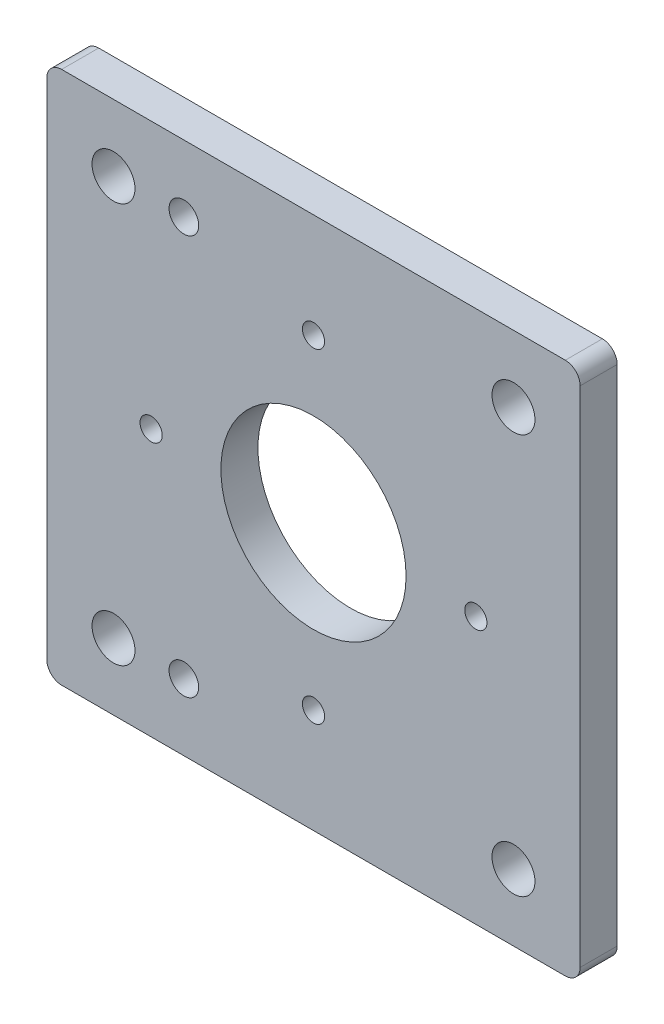
ISO-10303-21;
HEADER;
FILE_DESCRIPTION(('STEP AP214'),'2;1');
FILE_NAME('part.step','',(''),(''),'','','');
FILE_SCHEMA(('AUTOMOTIVE_DESIGN { 1 0 10303 214 1 1 1 1 }'));
ENDSEC;
DATA;
#1=APPLICATION_CONTEXT('core data for automotive mechanical design processes');
#2=APPLICATION_PROTOCOL_DEFINITION('international standard','automotive_design',2000,#1);
#3=PRODUCT_CONTEXT('',#1,'mechanical');
#4=PRODUCT('Part','Part','',(#3));
#5=PRODUCT_RELATED_PRODUCT_CATEGORY('part','',(#4));
#6=PRODUCT_DEFINITION_FORMATION('','',#4);
#7=PRODUCT_DEFINITION_CONTEXT('part definition',#1,'design');
#8=PRODUCT_DEFINITION('design','',#6,#7);
#9=PRODUCT_DEFINITION_SHAPE('','',#8);
#10=(LENGTH_UNIT() NAMED_UNIT(*) SI_UNIT(.MILLI.,.METRE.));
#11=(NAMED_UNIT(*) PLANE_ANGLE_UNIT() SI_UNIT($,.RADIAN.));
#12=(NAMED_UNIT(*) SI_UNIT($,.STERADIAN.) SOLID_ANGLE_UNIT());
#13=UNCERTAINTY_MEASURE_WITH_UNIT(LENGTH_MEASURE(1.E-05),#10,'distance_accuracy_value','');
#14=(GEOMETRIC_REPRESENTATION_CONTEXT(3) GLOBAL_UNCERTAINTY_ASSIGNED_CONTEXT((#13)) GLOBAL_UNIT_ASSIGNED_CONTEXT((#10,
#11,#12)) REPRESENTATION_CONTEXT('',''));
#15=CARTESIAN_POINT('',(0.,0.,0.));
#16=DIRECTION('',(0.,0.,1.));
#17=DIRECTION('',(1.,0.,0.));
#18=AXIS2_PLACEMENT_3D('',#15,#16,#17);
#19=CARTESIAN_POINT('',(0.,0.,5.));
#20=DIRECTION('',(0.,0.,1.));
#21=DIRECTION('',(1.,0.,0.));
#22=AXIS2_PLACEMENT_3D('',#19,#20,#21);
#23=PLANE('',#22);
#24=CARTESIAN_POINT('',(-17.5,-27.,5.));
#25=DIRECTION('',(0.,0.,1.));
#26=DIRECTION('',(1.,0.,0.));
#27=AXIS2_PLACEMENT_3D('',#24,#25,#26);
#28=CIRCLE('',#27,2.);
#29=CARTESIAN_POINT('',(-15.5,-27.,5.));
#30=VERTEX_POINT('',#29);
#31=EDGE_CURVE('E211',#30,#30,#28,.T.);
#32=ORIENTED_EDGE('',*,*,#31,.F.);
#33=EDGE_LOOP('',(#32));
#34=FACE_BOUND('',#33,.T.);
#35=CARTESIAN_POINT('',(-21.92,0.,5.));
#36=DIRECTION('',(0.,0.,1.));
#37=DIRECTION('',(1.,0.,0.));
#38=AXIS2_PLACEMENT_3D('',#35,#36,#37);
#39=CIRCLE('',#38,1.5);
#40=CARTESIAN_POINT('',(-20.42,0.,5.));
#41=VERTEX_POINT('',#40);
#42=EDGE_CURVE('E223',#41,#41,#39,.T.);
#43=ORIENTED_EDGE('',*,*,#42,.F.);
#44=EDGE_LOOP('',(#43));
#45=FACE_BOUND('',#44,.T.);
#46=CARTESIAN_POINT('',(0.,0.,5.));
#47=DIRECTION('',(0.,0.,1.));
#48=DIRECTION('',(1.,0.,0.));
#49=AXIS2_PLACEMENT_3D('',#46,#47,#48);
#50=CIRCLE('',#49,12.5);
#51=CARTESIAN_POINT('',(12.5,0.,5.));
#52=VERTEX_POINT('',#51);
#53=EDGE_CURVE('E233',#52,#52,#50,.T.);
#54=ORIENTED_EDGE('',*,*,#53,.F.);
#55=EDGE_LOOP('',(#54));
#56=FACE_BOUND('',#55,.T.);
#57=CARTESIAN_POINT('',(-27.,-27.,5.));
#58=DIRECTION('',(0.,0.,1.));
#59=DIRECTION('',(1.,0.,0.));
#60=AXIS2_PLACEMENT_3D('',#57,#58,#59);
#61=CIRCLE('',#60,2.9);
#62=CARTESIAN_POINT('',(-24.1,-27.,5.));
#63=VERTEX_POINT('',#62);
#64=EDGE_CURVE('E243',#63,#63,#61,.T.);
#65=ORIENTED_EDGE('',*,*,#64,.F.);
#66=EDGE_LOOP('',(#65));
#67=FACE_BOUND('',#66,.T.);
#68=CARTESIAN_POINT('',(27.,27.,5.));
#69=DIRECTION('',(0.,0.,1.));
#70=DIRECTION('',(1.,0.,0.));
#71=AXIS2_PLACEMENT_3D('',#68,#69,#70);
#72=CIRCLE('',#71,2.9);
#73=CARTESIAN_POINT('',(29.9,27.,5.));
#74=VERTEX_POINT('',#73);
#75=EDGE_CURVE('E253',#74,#74,#72,.T.);
#76=ORIENTED_EDGE('',*,*,#75,.F.);
#77=EDGE_LOOP('',(#76));
#78=FACE_BOUND('',#77,.T.);
#79=DIRECTION('',(0.,-1.,0.));
#80=VECTOR('',#79,1.);
#81=CARTESIAN_POINT('',(-36.,-36.,5.));
#82=LINE('',#81,#80);
#83=CARTESIAN_POINT('',(-36.,34.,5.));
#84=VERTEX_POINT('',#83);
#85=CARTESIAN_POINT('',(-36.,-34.,5.));
#86=VERTEX_POINT('',#85);
#87=EDGE_CURVE('E139',#84,#86,#82,.T.);
#88=ORIENTED_EDGE('',*,*,#87,.T.);
#89=CARTESIAN_POINT('',(-34.,-34.,5.));
#90=DIRECTION('',(0.,0.,1.));
#91=DIRECTION('',(1.,0.,0.));
#92=AXIS2_PLACEMENT_3D('',#89,#90,#91);
#93=CIRCLE('',#92,2.);
#94=CARTESIAN_POINT('',(-34.,-36.,5.));
#95=VERTEX_POINT('',#94);
#96=EDGE_CURVE('E154',#86,#95,#93,.T.);
#97=ORIENTED_EDGE('',*,*,#96,.T.);
#98=DIRECTION('',(1.,0.,0.));
#99=VECTOR('',#98,1.);
#100=CARTESIAN_POINT('',(36.,-36.,5.));
#101=LINE('',#100,#99);
#102=CARTESIAN_POINT('',(34.,-36.,5.));
#103=VERTEX_POINT('',#102);
#104=EDGE_CURVE('E121',#95,#103,#101,.T.);
#105=ORIENTED_EDGE('',*,*,#104,.T.);
#106=CARTESIAN_POINT('',(34.,-34.,5.));
#107=DIRECTION('',(0.,0.,1.));
#108=DIRECTION('',(1.,0.,0.));
#109=AXIS2_PLACEMENT_3D('',#106,#107,#108);
#110=CIRCLE('',#109,2.);
#111=CARTESIAN_POINT('',(36.,-34.,5.));
#112=VERTEX_POINT('',#111);
#113=EDGE_CURVE('E152',#103,#112,#110,.T.);
#114=ORIENTED_EDGE('',*,*,#113,.T.);
#115=DIRECTION('',(0.,1.,0.));
#116=VECTOR('',#115,1.);
#117=CARTESIAN_POINT('',(36.,-36.,5.));
#118=LINE('',#117,#116);
#119=CARTESIAN_POINT('',(36.,34.,5.));
#120=VERTEX_POINT('',#119);
#121=EDGE_CURVE('E174',#112,#120,#118,.T.);
#122=ORIENTED_EDGE('',*,*,#121,.T.);
#123=CARTESIAN_POINT('',(34.,34.,5.));
#124=DIRECTION('',(0.,0.,1.));
#125=DIRECTION('',(1.,0.,0.));
#126=AXIS2_PLACEMENT_3D('',#123,#124,#125);
#127=CIRCLE('',#126,2.);
#128=CARTESIAN_POINT('',(34.,36.,5.));
#129=VERTEX_POINT('',#128);
#130=EDGE_CURVE('E56',#120,#129,#127,.T.);
#131=ORIENTED_EDGE('',*,*,#130,.T.);
#132=DIRECTION('',(-1.,0.,0.));
#133=VECTOR('',#132,1.);
#134=CARTESIAN_POINT('',(36.,36.,5.));
#135=LINE('',#134,#133);
#136=CARTESIAN_POINT('',(-34.,36.,5.));
#137=VERTEX_POINT('',#136);
#138=EDGE_CURVE('E140',#129,#137,#135,.T.);
#139=ORIENTED_EDGE('',*,*,#138,.T.);
#140=CARTESIAN_POINT('',(-34.,34.,5.));
#141=DIRECTION('',(0.,0.,1.));
#142=DIRECTION('',(1.,0.,0.));
#143=AXIS2_PLACEMENT_3D('',#140,#141,#142);
#144=CIRCLE('',#143,2.);
#145=EDGE_CURVE('E150',#137,#84,#144,.T.);
#146=ORIENTED_EDGE('',*,*,#145,.T.);
#147=EDGE_LOOP('',(#88,#97,#105,#114,#122,#131,#139,#146));
#148=FACE_BOUND('',#147,.T.);
#149=CARTESIAN_POINT('',(-27.,27.,5.));
#150=DIRECTION('',(0.,0.,1.));
#151=DIRECTION('',(1.,0.,0.));
#152=AXIS2_PLACEMENT_3D('',#149,#150,#151);
#153=CIRCLE('',#152,2.9);
#154=CARTESIAN_POINT('',(-24.1,27.,5.));
#155=VERTEX_POINT('',#154);
#156=EDGE_CURVE('E134',#155,#155,#153,.T.);
#157=ORIENTED_EDGE('',*,*,#156,.F.);
#158=EDGE_LOOP('',(#157));
#159=FACE_BOUND('',#158,.T.);
#160=CARTESIAN_POINT('',(27.,-27.,5.));
#161=DIRECTION('',(0.,0.,1.));
#162=DIRECTION('',(1.,0.,0.));
#163=AXIS2_PLACEMENT_3D('',#160,#161,#162);
#164=CIRCLE('',#163,2.9);
#165=CARTESIAN_POINT('',(29.9,-27.,5.));
#166=VERTEX_POINT('',#165);
#167=EDGE_CURVE('E190',#166,#166,#164,.T.);
#168=ORIENTED_EDGE('',*,*,#167,.F.);
#169=EDGE_LOOP('',(#168));
#170=FACE_BOUND('',#169,.T.);
#171=CARTESIAN_POINT('',(0.,21.92,5.));
#172=DIRECTION('',(0.,0.,1.));
#173=DIRECTION('',(1.,0.,0.));
#174=AXIS2_PLACEMENT_3D('',#171,#172,#173);
#175=CIRCLE('',#174,1.5);
#176=CARTESIAN_POINT('',(1.5,21.92,5.));
#177=VERTEX_POINT('',#176);
#178=EDGE_CURVE('E194',#177,#177,#175,.T.);
#179=ORIENTED_EDGE('',*,*,#178,.F.);
#180=EDGE_LOOP('',(#179));
#181=FACE_BOUND('',#180,.T.);
#182=CARTESIAN_POINT('',(0.,-21.92,5.));
#183=DIRECTION('',(0.,0.,1.));
#184=DIRECTION('',(1.,0.,0.));
#185=AXIS2_PLACEMENT_3D('',#182,#183,#184);
#186=CIRCLE('',#185,1.5);
#187=CARTESIAN_POINT('',(1.5,-21.92,5.));
#188=VERTEX_POINT('',#187);
#189=EDGE_CURVE('E198',#188,#188,#186,.T.);
#190=ORIENTED_EDGE('',*,*,#189,.F.);
#191=EDGE_LOOP('',(#190));
#192=FACE_BOUND('',#191,.T.);
#193=CARTESIAN_POINT('',(21.92,0.,5.));
#194=DIRECTION('',(0.,0.,1.));
#195=DIRECTION('',(1.,0.,0.));
#196=AXIS2_PLACEMENT_3D('',#193,#194,#195);
#197=CIRCLE('',#196,1.5);
#198=CARTESIAN_POINT('',(23.42,0.,5.));
#199=VERTEX_POINT('',#198);
#200=EDGE_CURVE('E202',#199,#199,#197,.T.);
#201=ORIENTED_EDGE('',*,*,#200,.F.);
#202=EDGE_LOOP('',(#201));
#203=FACE_BOUND('',#202,.T.);
#204=CARTESIAN_POINT('',(-17.5,27.,5.));
#205=DIRECTION('',(0.,0.,1.));
#206=DIRECTION('',(1.,0.,0.));
#207=AXIS2_PLACEMENT_3D('',#204,#205,#206);
#208=CIRCLE('',#207,2.);
#209=CARTESIAN_POINT('',(-15.5,27.,5.));
#210=VERTEX_POINT('',#209);
#211=EDGE_CURVE('E205',#210,#210,#208,.T.);
#212=ORIENTED_EDGE('',*,*,#211,.F.);
#213=EDGE_LOOP('',(#212));
#214=FACE_BOUND('',#213,.T.);
#215=ADVANCED_FACE('F36',(#34,#45,#56,#67,#78,#148,#159,#170,#181,#192,#203,#214),#23,.T.);
#216=CARTESIAN_POINT('',(0.,0.,0.));
#217=DIRECTION('',(0.,0.,1.));
#218=DIRECTION('',(1.,0.,0.));
#219=AXIS2_PLACEMENT_3D('',#216,#217,#218);
#220=PLANE('',#219);
#221=DIRECTION('',(1.,0.,0.));
#222=VECTOR('',#221,1.);
#223=CARTESIAN_POINT('',(36.,-36.,0.));
#224=LINE('',#223,#222);
#225=CARTESIAN_POINT('',(-34.,-36.,0.));
#226=VERTEX_POINT('',#225);
#227=CARTESIAN_POINT('',(34.,-36.,0.));
#228=VERTEX_POINT('',#227);
#229=EDGE_CURVE('E118',#226,#228,#224,.T.);
#230=ORIENTED_EDGE('',*,*,#229,.F.);
#231=CARTESIAN_POINT('',(-34.,-34.,0.));
#232=DIRECTION('',(0.,0.,1.));
#233=DIRECTION('',(1.,0.,0.));
#234=AXIS2_PLACEMENT_3D('',#231,#232,#233);
#235=CIRCLE('',#234,2.);
#236=CARTESIAN_POINT('',(-36.,-34.,0.));
#237=VERTEX_POINT('',#236);
#238=EDGE_CURVE('E101',#226,#237,#235,.F.);
#239=ORIENTED_EDGE('',*,*,#238,.T.);
#240=DIRECTION('',(0.,-1.,0.));
#241=VECTOR('',#240,1.);
#242=CARTESIAN_POINT('',(-36.,-36.,0.));
#243=LINE('',#242,#241);
#244=CARTESIAN_POINT('',(-36.,34.,0.));
#245=VERTEX_POINT('',#244);
#246=EDGE_CURVE('E129',#245,#237,#243,.T.);
#247=ORIENTED_EDGE('',*,*,#246,.F.);
#248=CARTESIAN_POINT('',(-34.,34.,0.));
#249=DIRECTION('',(0.,0.,1.));
#250=DIRECTION('',(1.,0.,0.));
#251=AXIS2_PLACEMENT_3D('',#248,#249,#250);
#252=CIRCLE('',#251,2.);
#253=CARTESIAN_POINT('',(-34.,36.,0.));
#254=VERTEX_POINT('',#253);
#255=EDGE_CURVE('E143',#245,#254,#252,.F.);
#256=ORIENTED_EDGE('',*,*,#255,.T.);
#257=DIRECTION('',(-1.,0.,0.));
#258=VECTOR('',#257,1.);
#259=CARTESIAN_POINT('',(36.,36.,0.));
#260=LINE('',#259,#258);
#261=CARTESIAN_POINT('',(34.,36.,0.));
#262=VERTEX_POINT('',#261);
#263=EDGE_CURVE('E132',#262,#254,#260,.T.);
#264=ORIENTED_EDGE('',*,*,#263,.F.);
#265=CARTESIAN_POINT('',(34.,34.,0.));
#266=DIRECTION('',(0.,0.,1.));
#267=DIRECTION('',(1.,0.,0.));
#268=AXIS2_PLACEMENT_3D('',#265,#266,#267);
#269=CIRCLE('',#268,2.);
#270=CARTESIAN_POINT('',(36.,34.,0.));
#271=VERTEX_POINT('',#270);
#272=EDGE_CURVE('E122',#262,#271,#269,.F.);
#273=ORIENTED_EDGE('',*,*,#272,.T.);
#274=DIRECTION('',(0.,1.,0.));
#275=VECTOR('',#274,1.);
#276=CARTESIAN_POINT('',(36.,-36.,0.));
#277=LINE('',#276,#275);
#278=CARTESIAN_POINT('',(36.,-34.,0.));
#279=VERTEX_POINT('',#278);
#280=EDGE_CURVE('E128',#279,#271,#277,.T.);
#281=ORIENTED_EDGE('',*,*,#280,.F.);
#282=CARTESIAN_POINT('',(34.,-34.,0.));
#283=DIRECTION('',(0.,0.,1.));
#284=DIRECTION('',(1.,0.,0.));
#285=AXIS2_PLACEMENT_3D('',#282,#283,#284);
#286=CIRCLE('',#285,2.);
#287=EDGE_CURVE('E112',#279,#228,#286,.F.);
#288=ORIENTED_EDGE('',*,*,#287,.T.);
#289=EDGE_LOOP('',(#230,#239,#247,#256,#264,#273,#281,#288));
#290=FACE_BOUND('',#289,.T.);
#291=CARTESIAN_POINT('',(-27.,27.,0.));
#292=DIRECTION('',(0.,0.,1.));
#293=DIRECTION('',(1.,0.,0.));
#294=AXIS2_PLACEMENT_3D('',#291,#292,#293);
#295=CIRCLE('',#294,2.9);
#296=CARTESIAN_POINT('',(-24.1,27.,0.));
#297=VERTEX_POINT('',#296);
#298=EDGE_CURVE('E177',#297,#297,#295,.T.);
#299=ORIENTED_EDGE('',*,*,#298,.T.);
#300=EDGE_LOOP('',(#299));
#301=FACE_BOUND('',#300,.T.);
#302=CARTESIAN_POINT('',(27.,27.,0.));
#303=DIRECTION('',(0.,0.,1.));
#304=DIRECTION('',(1.,0.,0.));
#305=AXIS2_PLACEMENT_3D('',#302,#303,#304);
#306=CIRCLE('',#305,2.9);
#307=CARTESIAN_POINT('',(29.9,27.,0.));
#308=VERTEX_POINT('',#307);
#309=EDGE_CURVE('E250',#308,#308,#306,.T.);
#310=ORIENTED_EDGE('',*,*,#309,.T.);
#311=EDGE_LOOP('',(#310));
#312=FACE_BOUND('',#311,.T.);
#313=CARTESIAN_POINT('',(27.,-27.,0.));
#314=DIRECTION('',(0.,0.,1.));
#315=DIRECTION('',(1.,0.,0.));
#316=AXIS2_PLACEMENT_3D('',#313,#314,#315);
#317=CIRCLE('',#316,2.9);
#318=CARTESIAN_POINT('',(29.9,-27.,0.));
#319=VERTEX_POINT('',#318);
#320=EDGE_CURVE('E246',#319,#319,#317,.T.);
#321=ORIENTED_EDGE('',*,*,#320,.T.);
#322=EDGE_LOOP('',(#321));
#323=FACE_BOUND('',#322,.T.);
#324=CARTESIAN_POINT('',(-27.,-27.,0.));
#325=DIRECTION('',(0.,0.,1.));
#326=DIRECTION('',(1.,0.,0.));
#327=AXIS2_PLACEMENT_3D('',#324,#325,#326);
#328=CIRCLE('',#327,2.9);
#329=CARTESIAN_POINT('',(-24.1,-27.,0.));
#330=VERTEX_POINT('',#329);
#331=EDGE_CURVE('E240',#330,#330,#328,.T.);
#332=ORIENTED_EDGE('',*,*,#331,.T.);
#333=EDGE_LOOP('',(#332));
#334=FACE_BOUND('',#333,.T.);
#335=CARTESIAN_POINT('',(0.,21.92,0.));
#336=DIRECTION('',(0.,0.,1.));
#337=DIRECTION('',(1.,0.,0.));
#338=AXIS2_PLACEMENT_3D('',#335,#336,#337);
#339=CIRCLE('',#338,1.5);
#340=CARTESIAN_POINT('',(1.5,21.92,0.));
#341=VERTEX_POINT('',#340);
#342=EDGE_CURVE('E236',#341,#341,#339,.T.);
#343=ORIENTED_EDGE('',*,*,#342,.T.);
#344=EDGE_LOOP('',(#343));
#345=FACE_BOUND('',#344,.T.);
#346=CARTESIAN_POINT('',(0.,0.,0.));
#347=DIRECTION('',(0.,0.,1.));
#348=DIRECTION('',(1.,0.,0.));
#349=AXIS2_PLACEMENT_3D('',#346,#347,#348);
#350=CIRCLE('',#349,12.5);
#351=CARTESIAN_POINT('',(12.5,0.,0.));
#352=VERTEX_POINT('',#351);
#353=EDGE_CURVE('E230',#352,#352,#350,.T.);
#354=ORIENTED_EDGE('',*,*,#353,.T.);
#355=EDGE_LOOP('',(#354));
#356=FACE_BOUND('',#355,.T.);
#357=CARTESIAN_POINT('',(0.,-21.92,0.));
#358=DIRECTION('',(0.,0.,1.));
#359=DIRECTION('',(1.,0.,0.));
#360=AXIS2_PLACEMENT_3D('',#357,#358,#359);
#361=CIRCLE('',#360,1.5);
#362=CARTESIAN_POINT('',(1.5,-21.92,0.));
#363=VERTEX_POINT('',#362);
#364=EDGE_CURVE('E226',#363,#363,#361,.T.);
#365=ORIENTED_EDGE('',*,*,#364,.T.);
#366=EDGE_LOOP('',(#365));
#367=FACE_BOUND('',#366,.T.);
#368=CARTESIAN_POINT('',(-21.92,0.,0.));
#369=DIRECTION('',(0.,0.,1.));
#370=DIRECTION('',(1.,0.,0.));
#371=AXIS2_PLACEMENT_3D('',#368,#369,#370);
#372=CIRCLE('',#371,1.5);
#373=CARTESIAN_POINT('',(-20.42,0.,0.));
#374=VERTEX_POINT('',#373);
#375=EDGE_CURVE('E220',#374,#374,#372,.T.);
#376=ORIENTED_EDGE('',*,*,#375,.T.);
#377=EDGE_LOOP('',(#376));
#378=FACE_BOUND('',#377,.T.);
#379=CARTESIAN_POINT('',(21.92,0.,0.));
#380=DIRECTION('',(0.,0.,1.));
#381=DIRECTION('',(1.,0.,0.));
#382=AXIS2_PLACEMENT_3D('',#379,#380,#381);
#383=CIRCLE('',#382,1.5);
#384=CARTESIAN_POINT('',(23.42,0.,0.));
#385=VERTEX_POINT('',#384);
#386=EDGE_CURVE('E217',#385,#385,#383,.T.);
#387=ORIENTED_EDGE('',*,*,#386,.T.);
#388=EDGE_LOOP('',(#387));
#389=FACE_BOUND('',#388,.T.);
#390=CARTESIAN_POINT('',(-17.5,-27.,0.));
#391=DIRECTION('',(0.,0.,1.));
#392=DIRECTION('',(1.,0.,0.));
#393=AXIS2_PLACEMENT_3D('',#390,#391,#392);
#394=CIRCLE('',#393,2.);
#395=CARTESIAN_POINT('',(-15.5,-27.,0.));
#396=VERTEX_POINT('',#395);
#397=EDGE_CURVE('E207',#396,#396,#394,.T.);
#398=ORIENTED_EDGE('',*,*,#397,.T.);
#399=EDGE_LOOP('',(#398));
#400=FACE_BOUND('',#399,.T.);
#401=CARTESIAN_POINT('',(-17.5,27.,0.));
#402=DIRECTION('',(0.,0.,1.));
#403=DIRECTION('',(1.,0.,0.));
#404=AXIS2_PLACEMENT_3D('',#401,#402,#403);
#405=CIRCLE('',#404,2.);
#406=CARTESIAN_POINT('',(-15.5,27.,0.));
#407=VERTEX_POINT('',#406);
#408=EDGE_CURVE('E208',#407,#407,#405,.T.);
#409=ORIENTED_EDGE('',*,*,#408,.T.);
#410=EDGE_LOOP('',(#409));
#411=FACE_BOUND('',#410,.T.);
#412=ADVANCED_FACE('F125',(#290,#301,#312,#323,#334,#345,#356,#367,#378,#389,#400,#411),#220,.F.);
#413=CARTESIAN_POINT('',(-36.,-36.,5.));
#414=DIRECTION('',(1.,0.,0.));
#415=DIRECTION('',(0.,0.,-1.));
#416=AXIS2_PLACEMENT_3D('',#413,#414,#415);
#417=PLANE('',#416);
#418=ORIENTED_EDGE('',*,*,#246,.T.);
#419=DIRECTION('',(0.,0.,-1.));
#420=VECTOR('',#419,1.);
#421=CARTESIAN_POINT('',(-36.,-34.,5.));
#422=LINE('',#421,#420);
#423=EDGE_CURVE('E106',#237,#86,#422,.F.);
#424=ORIENTED_EDGE('',*,*,#423,.T.);
#425=ORIENTED_EDGE('',*,*,#87,.F.);
#426=DIRECTION('',(0.,0.,-1.));
#427=VECTOR('',#426,1.);
#428=CARTESIAN_POINT('',(-36.,34.,5.));
#429=LINE('',#428,#427);
#430=EDGE_CURVE('E111',#84,#245,#429,.T.);
#431=ORIENTED_EDGE('',*,*,#430,.T.);
#432=EDGE_LOOP('',(#418,#424,#425,#431));
#433=FACE_BOUND('',#432,.T.);
#434=ADVANCED_FACE('F171',(#433),#417,.F.);
#435=CARTESIAN_POINT('',(36.,-36.,5.));
#436=DIRECTION('',(0.,1.,0.));
#437=DIRECTION('',(-1.,0.,0.));
#438=AXIS2_PLACEMENT_3D('',#435,#436,#437);
#439=PLANE('',#438);
#440=ORIENTED_EDGE('',*,*,#104,.F.);
#441=DIRECTION('',(0.,0.,-1.));
#442=VECTOR('',#441,1.);
#443=CARTESIAN_POINT('',(-34.,-36.,5.));
#444=LINE('',#443,#442);
#445=EDGE_CURVE('E105',#95,#226,#444,.T.);
#446=ORIENTED_EDGE('',*,*,#445,.T.);
#447=ORIENTED_EDGE('',*,*,#229,.T.);
#448=DIRECTION('',(0.,0.,-1.));
#449=VECTOR('',#448,1.);
#450=CARTESIAN_POINT('',(34.,-36.,5.));
#451=LINE('',#450,#449);
#452=EDGE_CURVE('E123',#228,#103,#451,.F.);
#453=ORIENTED_EDGE('',*,*,#452,.T.);
#454=EDGE_LOOP('',(#440,#446,#447,#453));
#455=FACE_BOUND('',#454,.T.);
#456=ADVANCED_FACE('F117',(#455),#439,.F.);
#457=CARTESIAN_POINT('',(36.,-36.,5.));
#458=DIRECTION('',(-1.,0.,0.));
#459=DIRECTION('',(0.,0.,1.));
#460=AXIS2_PLACEMENT_3D('',#457,#458,#459);
#461=PLANE('',#460);
#462=ORIENTED_EDGE('',*,*,#121,.F.);
#463=DIRECTION('',(0.,0.,-1.));
#464=VECTOR('',#463,1.);
#465=CARTESIAN_POINT('',(36.,-34.,5.));
#466=LINE('',#465,#464);
#467=EDGE_CURVE('E158',#112,#279,#466,.T.);
#468=ORIENTED_EDGE('',*,*,#467,.T.);
#469=ORIENTED_EDGE('',*,*,#280,.T.);
#470=DIRECTION('',(0.,0.,-1.));
#471=VECTOR('',#470,1.);
#472=CARTESIAN_POINT('',(36.,34.,5.));
#473=LINE('',#472,#471);
#474=EDGE_CURVE('E156',#271,#120,#473,.F.);
#475=ORIENTED_EDGE('',*,*,#474,.T.);
#476=EDGE_LOOP('',(#462,#468,#469,#475));
#477=FACE_BOUND('',#476,.T.);
#478=ADVANCED_FACE('F273',(#477),#461,.F.);
#479=CARTESIAN_POINT('',(36.,36.,5.));
#480=DIRECTION('',(0.,-1.,0.));
#481=DIRECTION('',(1.,0.,0.));
#482=AXIS2_PLACEMENT_3D('',#479,#480,#481);
#483=PLANE('',#482);
#484=ORIENTED_EDGE('',*,*,#263,.T.);
#485=DIRECTION('',(0.,0.,-1.));
#486=VECTOR('',#485,1.);
#487=CARTESIAN_POINT('',(-34.,36.,5.));
#488=LINE('',#487,#486);
#489=EDGE_CURVE('E11',#254,#137,#488,.F.);
#490=ORIENTED_EDGE('',*,*,#489,.T.);
#491=ORIENTED_EDGE('',*,*,#138,.F.);
#492=DIRECTION('',(0.,0.,-1.));
#493=VECTOR('',#492,1.);
#494=CARTESIAN_POINT('',(34.,36.,5.));
#495=LINE('',#494,#493);
#496=EDGE_CURVE('E44',#129,#262,#495,.T.);
#497=ORIENTED_EDGE('',*,*,#496,.T.);
#498=EDGE_LOOP('',(#484,#490,#491,#497));
#499=FACE_BOUND('',#498,.T.);
#500=ADVANCED_FACE('F163',(#499),#483,.F.);
#501=CARTESIAN_POINT('',(-27.,27.,5.));
#502=DIRECTION('',(0.,0.,-1.));
#503=DIRECTION('',(-1.,0.,0.));
#504=AXIS2_PLACEMENT_3D('',#501,#502,#503);
#505=CYLINDRICAL_SURFACE('',#504,2.9);
#506=ORIENTED_EDGE('',*,*,#156,.T.);
#507=EDGE_LOOP('',(#506));
#508=FACE_BOUND('',#507,.T.);
#509=ORIENTED_EDGE('',*,*,#298,.F.);
#510=EDGE_LOOP('',(#509));
#511=FACE_BOUND('',#510,.T.);
#512=ADVANCED_FACE('F262',(#508,#511),#505,.F.);
#513=CARTESIAN_POINT('',(27.,27.,5.));
#514=DIRECTION('',(0.,0.,-1.));
#515=DIRECTION('',(-1.,0.,0.));
#516=AXIS2_PLACEMENT_3D('',#513,#514,#515);
#517=CYLINDRICAL_SURFACE('',#516,2.9);
#518=ORIENTED_EDGE('',*,*,#75,.T.);
#519=EDGE_LOOP('',(#518));
#520=FACE_BOUND('',#519,.T.);
#521=ORIENTED_EDGE('',*,*,#309,.F.);
#522=EDGE_LOOP('',(#521));
#523=FACE_BOUND('',#522,.T.);
#524=ADVANCED_FACE('F264',(#520,#523),#517,.F.);
#525=CARTESIAN_POINT('',(27.,-27.,5.));
#526=DIRECTION('',(0.,0.,-1.));
#527=DIRECTION('',(-1.,0.,0.));
#528=AXIS2_PLACEMENT_3D('',#525,#526,#527);
#529=CYLINDRICAL_SURFACE('',#528,2.9);
#530=ORIENTED_EDGE('',*,*,#167,.T.);
#531=EDGE_LOOP('',(#530));
#532=FACE_BOUND('',#531,.T.);
#533=ORIENTED_EDGE('',*,*,#320,.F.);
#534=EDGE_LOOP('',(#533));
#535=FACE_BOUND('',#534,.T.);
#536=ADVANCED_FACE('F270',(#532,#535),#529,.F.);
#537=CARTESIAN_POINT('',(-27.,-27.,5.));
#538=DIRECTION('',(0.,0.,-1.));
#539=DIRECTION('',(-1.,0.,0.));
#540=AXIS2_PLACEMENT_3D('',#537,#538,#539);
#541=CYLINDRICAL_SURFACE('',#540,2.9);
#542=ORIENTED_EDGE('',*,*,#64,.T.);
#543=EDGE_LOOP('',(#542));
#544=FACE_BOUND('',#543,.T.);
#545=ORIENTED_EDGE('',*,*,#331,.F.);
#546=EDGE_LOOP('',(#545));
#547=FACE_BOUND('',#546,.T.);
#548=ADVANCED_FACE('F423',(#544,#547),#541,.F.);
#549=CARTESIAN_POINT('',(0.,21.92,5.));
#550=DIRECTION('',(0.,0.,-1.));
#551=DIRECTION('',(-1.,0.,0.));
#552=AXIS2_PLACEMENT_3D('',#549,#550,#551);
#553=CYLINDRICAL_SURFACE('',#552,1.5);
#554=ORIENTED_EDGE('',*,*,#178,.T.);
#555=EDGE_LOOP('',(#554));
#556=FACE_BOUND('',#555,.T.);
#557=ORIENTED_EDGE('',*,*,#342,.F.);
#558=EDGE_LOOP('',(#557));
#559=FACE_BOUND('',#558,.T.);
#560=ADVANCED_FACE('F413',(#556,#559),#553,.F.);
#561=CARTESIAN_POINT('',(0.,0.,5.));
#562=DIRECTION('',(0.,0.,-1.));
#563=DIRECTION('',(-1.,0.,0.));
#564=AXIS2_PLACEMENT_3D('',#561,#562,#563);
#565=CYLINDRICAL_SURFACE('',#564,12.5);
#566=ORIENTED_EDGE('',*,*,#53,.T.);
#567=EDGE_LOOP('',(#566));
#568=FACE_BOUND('',#567,.T.);
#569=ORIENTED_EDGE('',*,*,#353,.F.);
#570=EDGE_LOOP('',(#569));
#571=FACE_BOUND('',#570,.T.);
#572=ADVANCED_FACE('F403',(#568,#571),#565,.F.);
#573=CARTESIAN_POINT('',(0.,-21.92,5.));
#574=DIRECTION('',(0.,0.,-1.));
#575=DIRECTION('',(-1.,0.,0.));
#576=AXIS2_PLACEMENT_3D('',#573,#574,#575);
#577=CYLINDRICAL_SURFACE('',#576,1.5);
#578=ORIENTED_EDGE('',*,*,#189,.T.);
#579=EDGE_LOOP('',(#578));
#580=FACE_BOUND('',#579,.T.);
#581=ORIENTED_EDGE('',*,*,#364,.F.);
#582=EDGE_LOOP('',(#581));
#583=FACE_BOUND('',#582,.T.);
#584=ADVANCED_FACE('F393',(#580,#583),#577,.F.);
#585=CARTESIAN_POINT('',(-21.92,0.,5.));
#586=DIRECTION('',(0.,0.,-1.));
#587=DIRECTION('',(-1.,0.,0.));
#588=AXIS2_PLACEMENT_3D('',#585,#586,#587);
#589=CYLINDRICAL_SURFACE('',#588,1.5);
#590=ORIENTED_EDGE('',*,*,#42,.T.);
#591=EDGE_LOOP('',(#590));
#592=FACE_BOUND('',#591,.T.);
#593=ORIENTED_EDGE('',*,*,#375,.F.);
#594=EDGE_LOOP('',(#593));
#595=FACE_BOUND('',#594,.T.);
#596=ADVANCED_FACE('F383',(#592,#595),#589,.F.);
#597=CARTESIAN_POINT('',(21.92,0.,5.));
#598=DIRECTION('',(0.,0.,-1.));
#599=DIRECTION('',(-1.,0.,0.));
#600=AXIS2_PLACEMENT_3D('',#597,#598,#599);
#601=CYLINDRICAL_SURFACE('',#600,1.5);
#602=ORIENTED_EDGE('',*,*,#200,.T.);
#603=EDGE_LOOP('',(#602));
#604=FACE_BOUND('',#603,.T.);
#605=ORIENTED_EDGE('',*,*,#386,.F.);
#606=EDGE_LOOP('',(#605));
#607=FACE_BOUND('',#606,.T.);
#608=ADVANCED_FACE('F373',(#604,#607),#601,.F.);
#609=CARTESIAN_POINT('',(-17.5,-27.,5.));
#610=DIRECTION('',(0.,0.,-1.));
#611=DIRECTION('',(-1.,0.,0.));
#612=AXIS2_PLACEMENT_3D('',#609,#610,#611);
#613=CYLINDRICAL_SURFACE('',#612,2.);
#614=ORIENTED_EDGE('',*,*,#31,.T.);
#615=EDGE_LOOP('',(#614));
#616=FACE_BOUND('',#615,.T.);
#617=ORIENTED_EDGE('',*,*,#397,.F.);
#618=EDGE_LOOP('',(#617));
#619=FACE_BOUND('',#618,.T.);
#620=ADVANCED_FACE('F364',(#616,#619),#613,.F.);
#621=CARTESIAN_POINT('',(-17.5,27.,5.));
#622=DIRECTION('',(0.,0.,-1.));
#623=DIRECTION('',(-1.,0.,0.));
#624=AXIS2_PLACEMENT_3D('',#621,#622,#623);
#625=CYLINDRICAL_SURFACE('',#624,2.);
#626=ORIENTED_EDGE('',*,*,#211,.T.);
#627=EDGE_LOOP('',(#626));
#628=FACE_BOUND('',#627,.T.);
#629=ORIENTED_EDGE('',*,*,#408,.F.);
#630=EDGE_LOOP('',(#629));
#631=FACE_BOUND('',#630,.T.);
#632=ADVANCED_FACE('F289',(#628,#631),#625,.F.);
#633=CARTESIAN_POINT('',(-34.,-34.,5.));
#634=DIRECTION('',(0.,0.,-1.));
#635=DIRECTION('',(-1.,0.,0.));
#636=AXIS2_PLACEMENT_3D('',#633,#634,#635);
#637=CYLINDRICAL_SURFACE('',#636,2.);
#638=ORIENTED_EDGE('',*,*,#96,.F.);
#639=ORIENTED_EDGE('',*,*,#423,.F.);
#640=ORIENTED_EDGE('',*,*,#238,.F.);
#641=ORIENTED_EDGE('',*,*,#445,.F.);
#642=EDGE_LOOP('',(#638,#639,#640,#641));
#643=FACE_BOUND('',#642,.T.);
#644=ADVANCED_FACE('F104',(#643),#637,.T.);
#645=CARTESIAN_POINT('',(34.,-34.,5.));
#646=DIRECTION('',(0.,0.,-1.));
#647=DIRECTION('',(-1.,0.,0.));
#648=AXIS2_PLACEMENT_3D('',#645,#646,#647);
#649=CYLINDRICAL_SURFACE('',#648,2.);
#650=ORIENTED_EDGE('',*,*,#113,.F.);
#651=ORIENTED_EDGE('',*,*,#452,.F.);
#652=ORIENTED_EDGE('',*,*,#287,.F.);
#653=ORIENTED_EDGE('',*,*,#467,.F.);
#654=EDGE_LOOP('',(#650,#651,#652,#653));
#655=FACE_BOUND('',#654,.T.);
#656=ADVANCED_FACE('F288',(#655),#649,.T.);
#657=CARTESIAN_POINT('',(-34.,34.,5.));
#658=DIRECTION('',(0.,0.,-1.));
#659=DIRECTION('',(-1.,0.,0.));
#660=AXIS2_PLACEMENT_3D('',#657,#658,#659);
#661=CYLINDRICAL_SURFACE('',#660,2.);
#662=ORIENTED_EDGE('',*,*,#145,.F.);
#663=ORIENTED_EDGE('',*,*,#489,.F.);
#664=ORIENTED_EDGE('',*,*,#255,.F.);
#665=ORIENTED_EDGE('',*,*,#430,.F.);
#666=EDGE_LOOP('',(#662,#663,#664,#665));
#667=FACE_BOUND('',#666,.T.);
#668=ADVANCED_FACE('F168',(#667),#661,.T.);
#669=CARTESIAN_POINT('',(34.,34.,5.));
#670=DIRECTION('',(0.,0.,-1.));
#671=DIRECTION('',(-1.,0.,0.));
#672=AXIS2_PLACEMENT_3D('',#669,#670,#671);
#673=CYLINDRICAL_SURFACE('',#672,2.);
#674=ORIENTED_EDGE('',*,*,#130,.F.);
#675=ORIENTED_EDGE('',*,*,#474,.F.);
#676=ORIENTED_EDGE('',*,*,#272,.F.);
#677=ORIENTED_EDGE('',*,*,#496,.F.);
#678=EDGE_LOOP('',(#674,#675,#676,#677));
#679=FACE_BOUND('',#678,.T.);
#680=ADVANCED_FACE('F38',(#679),#673,.T.);
#681=CLOSED_SHELL('',(#215,#412,#434,#456,#478,#500,#512,#524,#536,#548,#560,#572,#584,#596,
#608,#620,#632,#644,#656,#668,#680));
#682=MANIFOLD_SOLID_BREP('B2',#681);
#683=ADVANCED_BREP_SHAPE_REPRESENTATION('',(#18,#682),#14);
#684=SHAPE_DEFINITION_REPRESENTATION(#9,#683);
ENDSEC;
END-ISO-10303-21;
